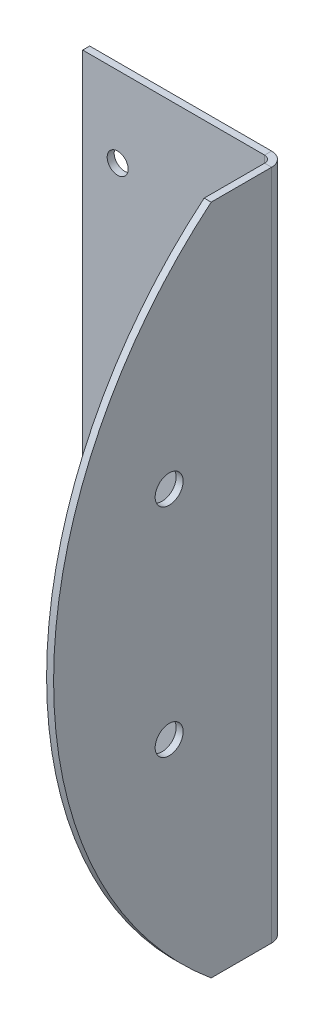
ISO-10303-21;
HEADER;
FILE_DESCRIPTION(('STEP AP214'),'2;1');
FILE_NAME('part.step','',(''),(''),'','','');
FILE_SCHEMA(('AUTOMOTIVE_DESIGN { 1 0 10303 214 1 1 1 1 }'));
ENDSEC;
DATA;
#1=APPLICATION_CONTEXT('core data for automotive mechanical design processes');
#2=APPLICATION_PROTOCOL_DEFINITION('international standard','automotive_design',2000,#1);
#3=PRODUCT_CONTEXT('',#1,'mechanical');
#4=PRODUCT('Part','Part','',(#3));
#5=PRODUCT_RELATED_PRODUCT_CATEGORY('part','',(#4));
#6=PRODUCT_DEFINITION_FORMATION('','',#4);
#7=PRODUCT_DEFINITION_CONTEXT('part definition',#1,'design');
#8=PRODUCT_DEFINITION('design','',#6,#7);
#9=PRODUCT_DEFINITION_SHAPE('','',#8);
#10=(LENGTH_UNIT() NAMED_UNIT(*) SI_UNIT(.MILLI.,.METRE.));
#11=(NAMED_UNIT(*) PLANE_ANGLE_UNIT() SI_UNIT($,.RADIAN.));
#12=(NAMED_UNIT(*) SI_UNIT($,.STERADIAN.) SOLID_ANGLE_UNIT());
#13=UNCERTAINTY_MEASURE_WITH_UNIT(LENGTH_MEASURE(1.E-05),#10,'distance_accuracy_value','');
#14=(GEOMETRIC_REPRESENTATION_CONTEXT(3) GLOBAL_UNCERTAINTY_ASSIGNED_CONTEXT((#13)) GLOBAL_UNIT_ASSIGNED_CONTEXT((#10,
#11,#12)) REPRESENTATION_CONTEXT('',''));
#15=CARTESIAN_POINT('',(0.,0.,0.));
#16=DIRECTION('',(0.,0.,1.));
#17=DIRECTION('',(1.,0.,0.));
#18=AXIS2_PLACEMENT_3D('',#15,#16,#17);
#19=CARTESIAN_POINT('',(367.658779797914,1.26287869051112E-12,-366.014974288105));
#20=DIRECTION('',(-1.,0.,0.));
#21=DIRECTION('',(0.,0.,1.));
#22=AXIS2_PLACEMENT_3D('',#19,#20,#21);
#23=PLANE('',#22);
#24=CARTESIAN_POINT('',(367.658779797912,16.7425760286225,16.6438055098074));
#25=DIRECTION('',(-1.,0.,0.));
#26=DIRECTION('',(0.,0.,1.));
#27=AXIS2_PLACEMENT_3D('',#24,#25,#26);
#28=CIRCLE('',#27,2.);
#29=CARTESIAN_POINT('',(367.658779797912,16.7425760286225,18.6438055098074));
#30=VERTEX_POINT('',#29);
#31=EDGE_CURVE('E193',#30,#30,#28,.T.);
#32=ORIENTED_EDGE('',*,*,#31,.T.);
#33=EDGE_LOOP('',(#32));
#34=FACE_BOUND('',#33,.T.);
#35=CARTESIAN_POINT('',(367.658779797912,47.7425760286225,16.6438055098075));
#36=DIRECTION('',(-1.,0.,0.));
#37=DIRECTION('',(0.,0.,1.));
#38=AXIS2_PLACEMENT_3D('',#35,#36,#37);
#39=CIRCLE('',#38,2.);
#40=CARTESIAN_POINT('',(367.658779797912,47.7425760286225,18.6438055098075));
#41=VERTEX_POINT('',#40);
#42=EDGE_CURVE('E196',#41,#41,#39,.T.);
#43=ORIENTED_EDGE('',*,*,#42,.T.);
#44=EDGE_LOOP('',(#43));
#45=FACE_BOUND('',#44,.T.);
#46=DIRECTION('',(0.,0.,1.));
#47=VECTOR('',#46,1.);
#48=CARTESIAN_POINT('',(367.658779797914,-15.7574239713762,-366.014974288105));
#49=LINE('',#48,#47);
#50=CARTESIAN_POINT('',(367.658779797912,-15.7574239713775,1.99999999999984));
#51=VERTEX_POINT('',#50);
#52=CARTESIAN_POINT('',(367.658779797912,-15.7574239713775,10.6438055098074));
#53=VERTEX_POINT('',#52);
#54=EDGE_CURVE('E58',#51,#53,#49,.T.);
#55=ORIENTED_EDGE('',*,*,#54,.F.);
#56=DIRECTION('',(0.,1.,0.));
#57=VECTOR('',#56,1.);
#58=CARTESIAN_POINT('',(367.658779797912,1.26287869051111E-12,1.99999999999984));
#59=LINE('',#58,#57);
#60=CARTESIAN_POINT('',(367.658779797912,80.2425760286225,1.99999999999984));
#61=VERTEX_POINT('',#60);
#62=EDGE_CURVE('E50',#51,#61,#59,.T.);
#63=ORIENTED_EDGE('',*,*,#62,.T.);
#64=DIRECTION('',(0.,0.,1.));
#65=VECTOR('',#64,1.);
#66=CARTESIAN_POINT('',(367.658779797913,80.2425760286238,-366.014974288104));
#67=LINE('',#66,#65);
#68=CARTESIAN_POINT('',(367.658779797912,80.2425760286225,10.6438055098074));
#69=VERTEX_POINT('',#68);
#70=EDGE_CURVE('E66',#61,#69,#67,.T.);
#71=ORIENTED_EDGE('',*,*,#70,.T.);
#72=CARTESIAN_POINT('',(367.658779797912,32.2425760286225,-29.2733286366336));
#73=DIRECTION('',(-1.,0.,0.));
#74=DIRECTION('',(0.,0.,1.));
#75=AXIS2_PLACEMENT_3D('',#72,#73,#74);
#76=CIRCLE('',#75,62.4289804374937);
#77=EDGE_CURVE('E144',#53,#69,#76,.T.);
#78=ORIENTED_EDGE('',*,*,#77,.F.);
#79=EDGE_LOOP('',(#55,#63,#71,#78));
#80=FACE_BOUND('',#79,.T.);
#81=ADVANCED_FACE('F41',(#34,#45,#80),#23,.F.);
#82=CARTESIAN_POINT('',(366.658779797913,80.2425760286238,-366.014974288104));
#83=DIRECTION('',(0.,-1.,0.));
#84=DIRECTION('',(0.,0.,1.));
#85=AXIS2_PLACEMENT_3D('',#82,#83,#84);
#86=PLANE('',#85);
#87=DIRECTION('',(1.,0.,0.));
#88=VECTOR('',#87,1.);
#89=CARTESIAN_POINT('',(366.658779797912,80.2425760286225,1.99999999999984));
#90=LINE('',#89,#88);
#91=CARTESIAN_POINT('',(366.658779797912,80.2425760286225,2.00000000000001));
#92=VERTEX_POINT('',#91);
#93=EDGE_CURVE('E206',#92,#61,#90,.T.);
#94=ORIENTED_EDGE('',*,*,#93,.F.);
#95=DIRECTION('',(0.,0.,1.));
#96=VECTOR('',#95,1.);
#97=CARTESIAN_POINT('',(366.658779797913,80.2425760286238,-366.014974288104));
#98=LINE('',#97,#96);
#99=CARTESIAN_POINT('',(366.658779797912,80.2425760286225,10.6438055098074));
#100=VERTEX_POINT('',#99);
#101=EDGE_CURVE('E183',#92,#100,#98,.T.);
#102=ORIENTED_EDGE('',*,*,#101,.T.);
#103=DIRECTION('',(-1.,0.,0.));
#104=VECTOR('',#103,1.);
#105=CARTESIAN_POINT('',(366.658779797912,80.2425760286225,10.6438055098074));
#106=LINE('',#105,#104);
#107=EDGE_CURVE('E199',#69,#100,#106,.T.);
#108=ORIENTED_EDGE('',*,*,#107,.F.);
#109=ORIENTED_EDGE('',*,*,#70,.F.);
#110=EDGE_LOOP('',(#94,#102,#108,#109));
#111=FACE_BOUND('',#110,.T.);
#112=ADVANCED_FACE('F211',(#111),#86,.F.);
#113=CARTESIAN_POINT('',(366.658779797914,-15.7574239713762,-366.014974288105));
#114=DIRECTION('',(0.,-1.,0.));
#115=DIRECTION('',(0.,0.,1.));
#116=AXIS2_PLACEMENT_3D('',#113,#114,#115);
#117=PLANE('',#116);
#118=DIRECTION('',(-1.,0.,0.));
#119=VECTOR('',#118,1.);
#120=CARTESIAN_POINT('',(366.658779797912,-15.7574239713775,1.99999999999984));
#121=LINE('',#120,#119);
#122=CARTESIAN_POINT('',(366.658779797912,-15.7574239713775,1.99999999999967));
#123=VERTEX_POINT('',#122);
#124=EDGE_CURVE('E12',#51,#123,#121,.T.);
#125=ORIENTED_EDGE('',*,*,#124,.F.);
#126=ORIENTED_EDGE('',*,*,#54,.T.);
#127=DIRECTION('',(-1.,0.,0.));
#128=VECTOR('',#127,1.);
#129=CARTESIAN_POINT('',(366.658779797912,-15.7574239713775,10.6438055098074));
#130=LINE('',#129,#128);
#131=CARTESIAN_POINT('',(366.658779797912,-15.7574239713775,10.6438055098074));
#132=VERTEX_POINT('',#131);
#133=EDGE_CURVE('E190',#53,#132,#130,.T.);
#134=ORIENTED_EDGE('',*,*,#133,.T.);
#135=DIRECTION('',(0.,0.,1.));
#136=VECTOR('',#135,1.);
#137=CARTESIAN_POINT('',(366.658779797914,-15.7574239713762,-366.014974288105));
#138=LINE('',#137,#136);
#139=EDGE_CURVE('E45',#123,#132,#138,.T.);
#140=ORIENTED_EDGE('',*,*,#139,.F.);
#141=EDGE_LOOP('',(#125,#126,#134,#140));
#142=FACE_BOUND('',#141,.T.);
#143=ADVANCED_FACE('F43',(#142),#117,.T.);
#144=CARTESIAN_POINT('',(366.658779797912,32.2425760286225,-29.2733286366336));
#145=DIRECTION('',(-1.,0.,0.));
#146=DIRECTION('',(0.,0.,1.));
#147=AXIS2_PLACEMENT_3D('',#144,#145,#146);
#148=CYLINDRICAL_SURFACE('',#147,62.4289804374937);
#149=ORIENTED_EDGE('',*,*,#77,.T.);
#150=ORIENTED_EDGE('',*,*,#107,.T.);
#151=CARTESIAN_POINT('',(366.658779797912,32.2425760286225,-29.2733286366336));
#152=DIRECTION('',(-1.,0.,0.));
#153=DIRECTION('',(0.,0.,1.));
#154=AXIS2_PLACEMENT_3D('',#151,#152,#153);
#155=CIRCLE('',#154,62.4289804374937);
#156=EDGE_CURVE('E180',#132,#100,#155,.T.);
#157=ORIENTED_EDGE('',*,*,#156,.F.);
#158=ORIENTED_EDGE('',*,*,#133,.F.);
#159=EDGE_LOOP('',(#149,#150,#157,#158));
#160=FACE_BOUND('',#159,.T.);
#161=ADVANCED_FACE('F215',(#160),#148,.T.);
#162=CARTESIAN_POINT('',(366.658779797912,16.7425760286225,16.6438055098074));
#163=DIRECTION('',(-1.,0.,0.));
#164=DIRECTION('',(0.,0.,1.));
#165=AXIS2_PLACEMENT_3D('',#162,#163,#164);
#166=CYLINDRICAL_SURFACE('',#165,2.);
#167=CARTESIAN_POINT('',(366.658779797912,16.7425760286225,16.6438055098074));
#168=DIRECTION('',(-1.,0.,0.));
#169=DIRECTION('',(0.,0.,1.));
#170=AXIS2_PLACEMENT_3D('',#167,#168,#169);
#171=CIRCLE('',#170,2.);
#172=CARTESIAN_POINT('',(366.658779797912,16.7425760286225,18.6438055098074));
#173=VERTEX_POINT('',#172);
#174=EDGE_CURVE('E184',#173,#173,#171,.T.);
#175=ORIENTED_EDGE('',*,*,#174,.T.);
#176=EDGE_LOOP('',(#175));
#177=FACE_BOUND('',#176,.T.);
#178=ORIENTED_EDGE('',*,*,#31,.F.);
#179=EDGE_LOOP('',(#178));
#180=FACE_BOUND('',#179,.T.);
#181=ADVANCED_FACE('F261',(#177,#180),#166,.F.);
#182=CARTESIAN_POINT('',(366.658779797912,47.7425760286225,16.6438055098075));
#183=DIRECTION('',(-1.,0.,0.));
#184=DIRECTION('',(0.,0.,1.));
#185=AXIS2_PLACEMENT_3D('',#182,#183,#184);
#186=CYLINDRICAL_SURFACE('',#185,2.);
#187=CARTESIAN_POINT('',(366.658779797912,47.7425760286225,16.6438055098075));
#188=DIRECTION('',(-1.,0.,0.));
#189=DIRECTION('',(0.,0.,1.));
#190=AXIS2_PLACEMENT_3D('',#187,#188,#189);
#191=CIRCLE('',#190,2.);
#192=CARTESIAN_POINT('',(366.658779797912,47.7425760286225,18.6438055098075));
#193=VERTEX_POINT('',#192);
#194=EDGE_CURVE('E187',#193,#193,#191,.T.);
#195=ORIENTED_EDGE('',*,*,#194,.T.);
#196=EDGE_LOOP('',(#195));
#197=FACE_BOUND('',#196,.T.);
#198=ORIENTED_EDGE('',*,*,#42,.F.);
#199=EDGE_LOOP('',(#198));
#200=FACE_BOUND('',#199,.T.);
#201=ADVANCED_FACE('F248',(#197,#200),#186,.F.);
#202=CARTESIAN_POINT('',(366.658779797914,1.25940924355916E-12,-366.014974288105));
#203=DIRECTION('',(-1.,0.,0.));
#204=DIRECTION('',(0.,0.,1.));
#205=AXIS2_PLACEMENT_3D('',#202,#203,#204);
#206=PLANE('',#205);
#207=DIRECTION('',(0.,1.,0.));
#208=VECTOR('',#207,1.);
#209=CARTESIAN_POINT('',(366.658779797912,1.25940924355916E-12,1.99999999999984));
#210=LINE('',#209,#208);
#211=EDGE_CURVE('E202',#123,#92,#210,.T.);
#212=ORIENTED_EDGE('',*,*,#211,.F.);
#213=ORIENTED_EDGE('',*,*,#139,.T.);
#214=ORIENTED_EDGE('',*,*,#156,.T.);
#215=ORIENTED_EDGE('',*,*,#101,.F.);
#216=EDGE_LOOP('',(#212,#213,#214,#215));
#217=FACE_BOUND('',#216,.T.);
#218=ORIENTED_EDGE('',*,*,#174,.F.);
#219=EDGE_LOOP('',(#218));
#220=FACE_BOUND('',#219,.T.);
#221=ORIENTED_EDGE('',*,*,#194,.F.);
#222=EDGE_LOOP('',(#221));
#223=FACE_BOUND('',#222,.T.);
#224=ADVANCED_FACE('F217',(#217,#220,#223),#206,.T.);
#225=CARTESIAN_POINT('',(339.658779797912,1.17842811827415E-12,1.));
#226=DIRECTION('',(-1.,0.,0.));
#227=DIRECTION('',(0.,-1.,0.));
#228=AXIS2_PLACEMENT_3D('',#225,#226,#227);
#229=PLANE('',#228);
#230=DIRECTION('',(0.,0.,1.));
#231=VECTOR('',#230,1.);
#232=CARTESIAN_POINT('',(339.658779797912,80.2425760286225,1.));
#233=LINE('',#232,#231);
#234=CARTESIAN_POINT('',(339.658779797912,80.2425760286225,0.));
#235=VERTEX_POINT('',#234);
#236=CARTESIAN_POINT('',(339.658779797912,80.2425760286225,1.));
#237=VERTEX_POINT('',#236);
#238=EDGE_CURVE('E160',#235,#237,#233,.T.);
#239=ORIENTED_EDGE('',*,*,#238,.F.);
#240=DIRECTION('',(0.,1.,0.));
#241=VECTOR('',#240,1.);
#242=CARTESIAN_POINT('',(339.658779797912,0.,0.));
#243=LINE('',#242,#241);
#244=CARTESIAN_POINT('',(339.658779797912,-15.7574239713775,0.));
#245=VERTEX_POINT('',#244);
#246=EDGE_CURVE('E175',#235,#245,#243,.F.);
#247=ORIENTED_EDGE('',*,*,#246,.T.);
#248=DIRECTION('',(0.,0.,1.));
#249=VECTOR('',#248,1.);
#250=CARTESIAN_POINT('',(339.658779797912,-15.7574239713775,1.));
#251=LINE('',#250,#249);
#252=CARTESIAN_POINT('',(339.658779797912,-15.7574239713775,1.));
#253=VERTEX_POINT('',#252);
#254=EDGE_CURVE('E173',#245,#253,#251,.T.);
#255=ORIENTED_EDGE('',*,*,#254,.T.);
#256=DIRECTION('',(0.,-1.,0.));
#257=VECTOR('',#256,1.);
#258=CARTESIAN_POINT('',(339.658779797912,1.17842811827415E-12,1.));
#259=LINE('',#258,#257);
#260=EDGE_CURVE('E128',#237,#253,#259,.T.);
#261=ORIENTED_EDGE('',*,*,#260,.F.);
#262=EDGE_LOOP('',(#239,#247,#255,#261));
#263=FACE_BOUND('',#262,.T.);
#264=ADVANCED_FACE('F237',(#263),#229,.T.);
#265=CARTESIAN_POINT('',(344.658779797912,68.7425760286226,1.));
#266=DIRECTION('',(0.,0.,1.));
#267=DIRECTION('',(1.,0.,0.));
#268=AXIS2_PLACEMENT_3D('',#265,#266,#267);
#269=CYLINDRICAL_SURFACE('',#268,1.50000000000002);
#270=CARTESIAN_POINT('',(344.658779797912,68.7425760286226,1.));
#271=DIRECTION('',(0.,0.,1.));
#272=DIRECTION('',(1.,0.,0.));
#273=AXIS2_PLACEMENT_3D('',#270,#271,#272);
#274=CIRCLE('',#273,1.50000000000002);
#275=CARTESIAN_POINT('',(346.158779797912,68.7425760286226,1.));
#276=VERTEX_POINT('',#275);
#277=EDGE_CURVE('E170',#276,#276,#274,.T.);
#278=ORIENTED_EDGE('',*,*,#277,.T.);
#279=EDGE_LOOP('',(#278));
#280=FACE_BOUND('',#279,.T.);
#281=CARTESIAN_POINT('',(344.658779797912,68.7425760286226,0.));
#282=DIRECTION('',(0.,0.,1.));
#283=DIRECTION('',(1.,0.,0.));
#284=AXIS2_PLACEMENT_3D('',#281,#282,#283);
#285=CIRCLE('',#284,1.50000000000002);
#286=CARTESIAN_POINT('',(346.158779797912,68.7425760286226,0.));
#287=VERTEX_POINT('',#286);
#288=EDGE_CURVE('E154',#287,#287,#285,.T.);
#289=ORIENTED_EDGE('',*,*,#288,.F.);
#290=EDGE_LOOP('',(#289));
#291=FACE_BOUND('',#290,.T.);
#292=ADVANCED_FACE('F239',(#280,#291),#269,.F.);
#293=CARTESIAN_POINT('',(344.658779797912,-4.25742397137745,1.));
#294=DIRECTION('',(0.,0.,1.));
#295=DIRECTION('',(1.,0.,0.));
#296=AXIS2_PLACEMENT_3D('',#293,#294,#295);
#297=CYLINDRICAL_SURFACE('',#296,1.50000000000002);
#298=CARTESIAN_POINT('',(344.658779797912,-4.25742397137745,1.));
#299=DIRECTION('',(0.,0.,1.));
#300=DIRECTION('',(1.,0.,0.));
#301=AXIS2_PLACEMENT_3D('',#298,#299,#300);
#302=CIRCLE('',#301,1.50000000000002);
#303=CARTESIAN_POINT('',(346.158779797912,-4.25742397137745,1.));
#304=VERTEX_POINT('',#303);
#305=EDGE_CURVE('E136',#304,#304,#302,.T.);
#306=ORIENTED_EDGE('',*,*,#305,.T.);
#307=EDGE_LOOP('',(#306));
#308=FACE_BOUND('',#307,.T.);
#309=CARTESIAN_POINT('',(344.658779797912,-4.25742397137745,0.));
#310=DIRECTION('',(0.,0.,1.));
#311=DIRECTION('',(1.,0.,0.));
#312=AXIS2_PLACEMENT_3D('',#309,#310,#311);
#313=CIRCLE('',#312,1.50000000000002);
#314=CARTESIAN_POINT('',(346.158779797912,-4.25742397137745,0.));
#315=VERTEX_POINT('',#314);
#316=EDGE_CURVE('E146',#315,#315,#313,.T.);
#317=ORIENTED_EDGE('',*,*,#316,.F.);
#318=EDGE_LOOP('',(#317));
#319=FACE_BOUND('',#318,.T.);
#320=ADVANCED_FACE('F245',(#308,#319),#297,.F.);
#321=CARTESIAN_POINT('',(0.,0.,1.));
#322=DIRECTION('',(0.,0.,1.));
#323=DIRECTION('',(1.,0.,0.));
#324=AXIS2_PLACEMENT_3D('',#321,#322,#323);
#325=PLANE('',#324);
#326=ORIENTED_EDGE('',*,*,#305,.F.);
#327=EDGE_LOOP('',(#326));
#328=FACE_BOUND('',#327,.T.);
#329=ORIENTED_EDGE('',*,*,#277,.F.);
#330=EDGE_LOOP('',(#329));
#331=FACE_BOUND('',#330,.T.);
#332=DIRECTION('',(1.,0.,0.));
#333=VECTOR('',#332,1.);
#334=CARTESIAN_POINT('',(0.,-15.7574239713775,1.));
#335=LINE('',#334,#333);
#336=CARTESIAN_POINT('',(365.658779797912,-15.7574239713775,1.));
#337=VERTEX_POINT('',#336);
#338=EDGE_CURVE('E129',#253,#337,#335,.T.);
#339=ORIENTED_EDGE('',*,*,#338,.T.);
#340=DIRECTION('',(0.,1.,0.));
#341=VECTOR('',#340,1.);
#342=CARTESIAN_POINT('',(365.658779797912,1.26863373902494E-12,1.));
#343=LINE('',#342,#341);
#344=CARTESIAN_POINT('',(365.658779797912,80.2425760286225,1.));
#345=VERTEX_POINT('',#344);
#346=EDGE_CURVE('E121',#337,#345,#343,.T.);
#347=ORIENTED_EDGE('',*,*,#346,.T.);
#348=DIRECTION('',(1.,0.,0.));
#349=VECTOR('',#348,1.);
#350=CARTESIAN_POINT('',(0.,80.2425760286225,1.));
#351=LINE('',#350,#349);
#352=EDGE_CURVE('E165',#237,#345,#351,.T.);
#353=ORIENTED_EDGE('',*,*,#352,.F.);
#354=ORIENTED_EDGE('',*,*,#260,.T.);
#355=EDGE_LOOP('',(#339,#347,#353,#354));
#356=FACE_BOUND('',#355,.T.);
#357=ADVANCED_FACE('F133',(#328,#331,#356),#325,.T.);
#358=CARTESIAN_POINT('',(0.,80.2425760286225,1.));
#359=DIRECTION('',(0.,-1.,0.));
#360=DIRECTION('',(1.,0.,0.));
#361=AXIS2_PLACEMENT_3D('',#358,#359,#360);
#362=PLANE('',#361);
#363=ORIENTED_EDGE('',*,*,#352,.T.);
#364=DIRECTION('',(0.,0.,-1.));
#365=VECTOR('',#364,1.);
#366=CARTESIAN_POINT('',(365.658779797912,80.2425760286225,1.));
#367=LINE('',#366,#365);
#368=CARTESIAN_POINT('',(365.658779797912,80.2425760286225,0.));
#369=VERTEX_POINT('',#368);
#370=EDGE_CURVE('E162',#345,#369,#367,.T.);
#371=ORIENTED_EDGE('',*,*,#370,.T.);
#372=DIRECTION('',(1.,0.,0.));
#373=VECTOR('',#372,1.);
#374=CARTESIAN_POINT('',(0.,80.2425760286225,0.));
#375=LINE('',#374,#373);
#376=EDGE_CURVE('E157',#235,#369,#375,.T.);
#377=ORIENTED_EDGE('',*,*,#376,.F.);
#378=ORIENTED_EDGE('',*,*,#238,.T.);
#379=EDGE_LOOP('',(#363,#371,#377,#378));
#380=FACE_BOUND('',#379,.T.);
#381=ADVANCED_FACE('F235',(#380),#362,.F.);
#382=CARTESIAN_POINT('',(0.,0.,0.));
#383=DIRECTION('',(0.,0.,1.));
#384=DIRECTION('',(1.,0.,0.));
#385=AXIS2_PLACEMENT_3D('',#382,#383,#384);
#386=PLANE('',#385);
#387=DIRECTION('',(0.,1.,0.));
#388=VECTOR('',#387,1.);
#389=CARTESIAN_POINT('',(365.658779797912,1.26863373902494E-12,0.));
#390=LINE('',#389,#388);
#391=CARTESIAN_POINT('',(365.658779797912,-15.7574239713775,0.));
#392=VERTEX_POINT('',#391);
#393=EDGE_CURVE('E178',#392,#369,#390,.T.);
#394=ORIENTED_EDGE('',*,*,#393,.F.);
#395=DIRECTION('',(1.,0.,0.));
#396=VECTOR('',#395,1.);
#397=CARTESIAN_POINT('',(0.,-15.7574239713775,0.));
#398=LINE('',#397,#396);
#399=EDGE_CURVE('E141',#245,#392,#398,.T.);
#400=ORIENTED_EDGE('',*,*,#399,.F.);
#401=ORIENTED_EDGE('',*,*,#246,.F.);
#402=ORIENTED_EDGE('',*,*,#376,.T.);
#403=EDGE_LOOP('',(#394,#400,#401,#402));
#404=FACE_BOUND('',#403,.T.);
#405=ORIENTED_EDGE('',*,*,#288,.T.);
#406=EDGE_LOOP('',(#405));
#407=FACE_BOUND('',#406,.T.);
#408=ORIENTED_EDGE('',*,*,#316,.T.);
#409=EDGE_LOOP('',(#408));
#410=FACE_BOUND('',#409,.T.);
#411=ADVANCED_FACE('F230',(#404,#407,#410),#386,.F.);
#412=CARTESIAN_POINT('',(0.,-15.7574239713775,1.));
#413=DIRECTION('',(0.,-1.,0.));
#414=DIRECTION('',(1.,0.,0.));
#415=AXIS2_PLACEMENT_3D('',#412,#413,#414);
#416=PLANE('',#415);
#417=ORIENTED_EDGE('',*,*,#399,.T.);
#418=DIRECTION('',(0.,0.,1.));
#419=VECTOR('',#418,1.);
#420=CARTESIAN_POINT('',(365.658779797912,-15.7574239713775,1.));
#421=LINE('',#420,#419);
#422=EDGE_CURVE('E112',#392,#337,#421,.T.);
#423=ORIENTED_EDGE('',*,*,#422,.T.);
#424=ORIENTED_EDGE('',*,*,#338,.F.);
#425=ORIENTED_EDGE('',*,*,#254,.F.);
#426=EDGE_LOOP('',(#417,#423,#424,#425));
#427=FACE_BOUND('',#426,.T.);
#428=ADVANCED_FACE('F139',(#427),#416,.T.);
#429=CARTESIAN_POINT('',(365.658779797912,-15.7574239713775,2.));
#430=DIRECTION('',(0.,1.,0.));
#431=DIRECTION('',(0.,0.,1.));
#432=AXIS2_PLACEMENT_3D('',#429,#430,#431);
#433=PLANE('',#432);
#434=ORIENTED_EDGE('',*,*,#422,.F.);
#435=CARTESIAN_POINT('',(365.658779797912,-15.7574239713775,2.));
#436=DIRECTION('',(0.,1.,0.));
#437=DIRECTION('',(-1.,0.,0.));
#438=AXIS2_PLACEMENT_3D('',#435,#436,#437);
#439=CIRCLE('',#438,2.);
#440=EDGE_CURVE('E149',#392,#51,#439,.F.);
#441=ORIENTED_EDGE('',*,*,#440,.T.);
#442=ORIENTED_EDGE('',*,*,#124,.T.);
#443=CARTESIAN_POINT('',(365.658779797912,-15.7574239713775,2.));
#444=DIRECTION('',(0.,-1.,0.));
#445=DIRECTION('',(0.,0.,-1.));
#446=AXIS2_PLACEMENT_3D('',#443,#444,#445);
#447=CIRCLE('',#446,1.);
#448=EDGE_CURVE('E107',#337,#123,#447,.T.);
#449=ORIENTED_EDGE('',*,*,#448,.F.);
#450=EDGE_LOOP('',(#434,#441,#442,#449));
#451=FACE_BOUND('',#450,.T.);
#452=ADVANCED_FACE('F109',(#451),#433,.F.);
#453=CARTESIAN_POINT('',(365.658779797912,80.2425760286225,2.));
#454=DIRECTION('',(0.,-1.,0.));
#455=DIRECTION('',(0.,0.,-1.));
#456=AXIS2_PLACEMENT_3D('',#453,#454,#455);
#457=PLANE('',#456);
#458=ORIENTED_EDGE('',*,*,#93,.T.);
#459=CARTESIAN_POINT('',(365.658779797912,80.2425760286225,2.));
#460=DIRECTION('',(0.,1.,0.));
#461=DIRECTION('',(-1.,0.,0.));
#462=AXIS2_PLACEMENT_3D('',#459,#460,#461);
#463=CIRCLE('',#462,2.);
#464=EDGE_CURVE('E117',#61,#369,#463,.T.);
#465=ORIENTED_EDGE('',*,*,#464,.T.);
#466=ORIENTED_EDGE('',*,*,#370,.F.);
#467=CARTESIAN_POINT('',(365.658779797912,80.2425760286225,2.));
#468=DIRECTION('',(0.,1.,0.));
#469=DIRECTION('',(0.,0.,-1.));
#470=AXIS2_PLACEMENT_3D('',#467,#468,#469);
#471=CIRCLE('',#470,1.);
#472=EDGE_CURVE('E116',#92,#345,#471,.T.);
#473=ORIENTED_EDGE('',*,*,#472,.F.);
#474=EDGE_LOOP('',(#458,#465,#466,#473));
#475=FACE_BOUND('',#474,.T.);
#476=ADVANCED_FACE('F226',(#475),#457,.F.);
#477=CARTESIAN_POINT('',(365.658779797912,-63.7915410989672,2.));
#478=DIRECTION('',(0.,1.,0.));
#479=DIRECTION('',(-1.,0.,0.));
#480=AXIS2_PLACEMENT_3D('',#477,#478,#479);
#481=CYLINDRICAL_SURFACE('',#480,1.);
#482=ORIENTED_EDGE('',*,*,#472,.T.);
#483=ORIENTED_EDGE('',*,*,#346,.F.);
#484=ORIENTED_EDGE('',*,*,#448,.T.);
#485=ORIENTED_EDGE('',*,*,#211,.T.);
#486=EDGE_LOOP('',(#482,#483,#484,#485));
#487=FACE_BOUND('',#486,.T.);
#488=ADVANCED_FACE('F123',(#487),#481,.F.);
#489=CARTESIAN_POINT('',(365.658779797912,-63.7915410989672,2.));
#490=DIRECTION('',(0.,1.,0.));
#491=DIRECTION('',(-1.,0.,0.));
#492=AXIS2_PLACEMENT_3D('',#489,#490,#491);
#493=CYLINDRICAL_SURFACE('',#492,2.);
#494=ORIENTED_EDGE('',*,*,#464,.F.);
#495=ORIENTED_EDGE('',*,*,#62,.F.);
#496=ORIENTED_EDGE('',*,*,#440,.F.);
#497=ORIENTED_EDGE('',*,*,#393,.T.);
#498=EDGE_LOOP('',(#494,#495,#496,#497));
#499=FACE_BOUND('',#498,.T.);
#500=ADVANCED_FACE('F227',(#499),#493,.T.);
#501=CLOSED_SHELL('',(#81,#112,#143,#161,#181,#201,#224,#264,#292,#320,#357,#381,#411,#428,#452,
#476,#488,#500));
#502=MANIFOLD_SOLID_BREP('B2',#501);
#503=ADVANCED_BREP_SHAPE_REPRESENTATION('',(#18,#502),#14);
#504=SHAPE_DEFINITION_REPRESENTATION(#9,#503);
ENDSEC;
END-ISO-10303-21;
